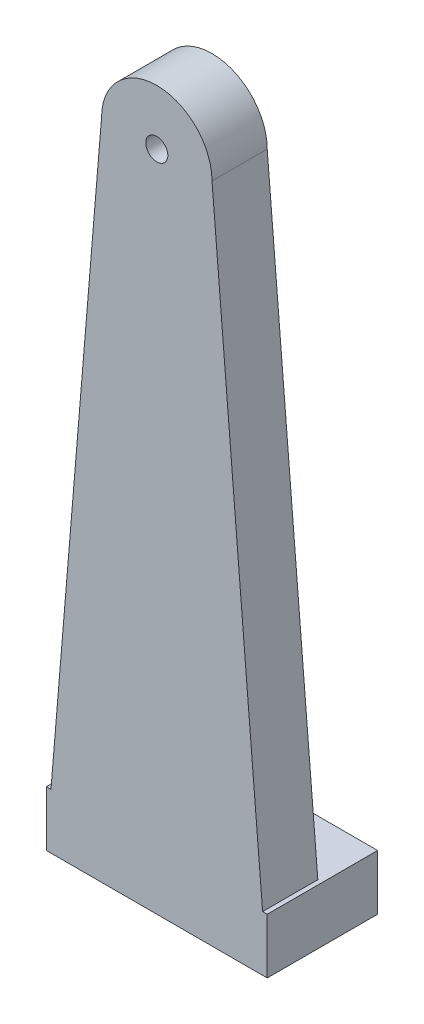
ISO-10303-21;
HEADER;
FILE_DESCRIPTION(('STEP AP214'),'2;1');
FILE_NAME('part.step','',(''),(''),'','','');
FILE_SCHEMA(('AUTOMOTIVE_DESIGN { 1 0 10303 214 1 1 1 1 }'));
ENDSEC;
DATA;
#1=APPLICATION_CONTEXT('core data for automotive mechanical design processes');
#2=APPLICATION_PROTOCOL_DEFINITION('international standard','automotive_design',2000,#1);
#3=PRODUCT_CONTEXT('',#1,'mechanical');
#4=PRODUCT('Part','Part','',(#3));
#5=PRODUCT_RELATED_PRODUCT_CATEGORY('part','',(#4));
#6=PRODUCT_DEFINITION_FORMATION('','',#4);
#7=PRODUCT_DEFINITION_CONTEXT('part definition',#1,'design');
#8=PRODUCT_DEFINITION('design','',#6,#7);
#9=PRODUCT_DEFINITION_SHAPE('','',#8);
#10=(LENGTH_UNIT() NAMED_UNIT(*) SI_UNIT(.MILLI.,.METRE.));
#11=(NAMED_UNIT(*) PLANE_ANGLE_UNIT() SI_UNIT($,.RADIAN.));
#12=(NAMED_UNIT(*) SI_UNIT($,.STERADIAN.) SOLID_ANGLE_UNIT());
#13=UNCERTAINTY_MEASURE_WITH_UNIT(LENGTH_MEASURE(1.E-05),#10,'distance_accuracy_value','');
#14=(GEOMETRIC_REPRESENTATION_CONTEXT(3) GLOBAL_UNCERTAINTY_ASSIGNED_CONTEXT((#13)) GLOBAL_UNIT_ASSIGNED_CONTEXT((#10,
#11,#12)) REPRESENTATION_CONTEXT('',''));
#15=CARTESIAN_POINT('',(0.,0.,0.));
#16=DIRECTION('',(0.,0.,1.));
#17=DIRECTION('',(1.,0.,0.));
#18=AXIS2_PLACEMENT_3D('',#15,#16,#17);
#19=CARTESIAN_POINT('',(5.,35.,5.));
#20=DIRECTION('',(-0.99654575824488,-0.0830454798537399,0.));
#21=DIRECTION('',(0.0830454798537399,-0.99654575824488,0.));
#22=AXIS2_PLACEMENT_3D('',#19,#20,#21);
#23=PLANE('',#22);
#24=DIRECTION('',(-0.0830454798537399,0.99654575824488,0.));
#25=VECTOR('',#24,1.);
#26=CARTESIAN_POINT('',(5.,35.,5.));
#27=LINE('',#26,#25);
#28=CARTESIAN_POINT('',(9.58333333333333,-20.,5.));
#29=VERTEX_POINT('',#28);
#30=CARTESIAN_POINT('',(5.,35.,5.));
#31=VERTEX_POINT('',#30);
#32=EDGE_CURVE('E60',#29,#31,#27,.T.);
#33=ORIENTED_EDGE('',*,*,#32,.F.);
#34=DIRECTION('',(0.,0.,-1.));
#35=VECTOR('',#34,1.);
#36=CARTESIAN_POINT('',(9.58333333333333,-20.,5.));
#37=LINE('',#36,#35);
#38=CARTESIAN_POINT('',(9.58333333333333,-20.,0.));
#39=VERTEX_POINT('',#38);
#40=EDGE_CURVE('E151',#29,#39,#37,.T.);
#41=ORIENTED_EDGE('',*,*,#40,.T.);
#42=DIRECTION('',(-0.0830454798537399,0.99654575824488,0.));
#43=VECTOR('',#42,1.);
#44=CARTESIAN_POINT('',(5.,35.,0.));
#45=LINE('',#44,#43);
#46=CARTESIAN_POINT('',(5.,35.,0.));
#47=VERTEX_POINT('',#46);
#48=EDGE_CURVE('E72',#39,#47,#45,.T.);
#49=ORIENTED_EDGE('',*,*,#48,.T.);
#50=DIRECTION('',(0.,0.,-1.));
#51=VECTOR('',#50,1.);
#52=CARTESIAN_POINT('',(5.,35.,5.));
#53=LINE('',#52,#51);
#54=EDGE_CURVE('E135',#31,#47,#53,.T.);
#55=ORIENTED_EDGE('',*,*,#54,.F.);
#56=EDGE_LOOP('',(#33,#41,#49,#55));
#57=FACE_BOUND('',#56,.T.);
#58=ADVANCED_FACE('F39',(#57),#23,.F.);
#59=CARTESIAN_POINT('',(-5.,35.,5.));
#60=DIRECTION('',(0.99654575824488,-0.0830454798537399,0.));
#61=DIRECTION('',(0.0830454798537399,0.99654575824488,0.));
#62=AXIS2_PLACEMENT_3D('',#59,#60,#61);
#63=PLANE('',#62);
#64=DIRECTION('',(-0.0830454798537399,-0.99654575824488,0.));
#65=VECTOR('',#64,1.);
#66=CARTESIAN_POINT('',(-5.,35.,0.));
#67=LINE('',#66,#65);
#68=CARTESIAN_POINT('',(-5.,35.,0.));
#69=VERTEX_POINT('',#68);
#70=CARTESIAN_POINT('',(-9.58333333333333,-20.,0.));
#71=VERTEX_POINT('',#70);
#72=EDGE_CURVE('E148',#69,#71,#67,.T.);
#73=ORIENTED_EDGE('',*,*,#72,.T.);
#74=DIRECTION('',(0.,0.,1.));
#75=VECTOR('',#74,1.);
#76=CARTESIAN_POINT('',(-9.58333333333333,-20.,5.));
#77=LINE('',#76,#75);
#78=CARTESIAN_POINT('',(-9.58333333333333,-20.,5.));
#79=VERTEX_POINT('',#78);
#80=EDGE_CURVE('E86',#71,#79,#77,.T.);
#81=ORIENTED_EDGE('',*,*,#80,.T.);
#82=DIRECTION('',(-0.0830454798537399,-0.99654575824488,0.));
#83=VECTOR('',#82,1.);
#84=CARTESIAN_POINT('',(-5.,35.,5.));
#85=LINE('',#84,#83);
#86=CARTESIAN_POINT('',(-5.,35.,5.));
#87=VERTEX_POINT('',#86);
#88=EDGE_CURVE('E154',#87,#79,#85,.T.);
#89=ORIENTED_EDGE('',*,*,#88,.F.);
#90=DIRECTION('',(0.,0.,-1.));
#91=VECTOR('',#90,1.);
#92=CARTESIAN_POINT('',(-5.,35.,5.));
#93=LINE('',#92,#91);
#94=EDGE_CURVE('E136',#87,#69,#93,.T.);
#95=ORIENTED_EDGE('',*,*,#94,.T.);
#96=EDGE_LOOP('',(#73,#81,#89,#95));
#97=FACE_BOUND('',#96,.T.);
#98=ADVANCED_FACE('F200',(#97),#63,.F.);
#99=CARTESIAN_POINT('',(10.,-25.,5.));
#100=DIRECTION('',(0.,1.,0.));
#101=DIRECTION('',(0.,0.,1.));
#102=AXIS2_PLACEMENT_3D('',#99,#100,#101);
#103=PLANE('',#102);
#104=CARTESIAN_POINT('',(0.,-25.,0.));
#105=DIRECTION('',(0.,-1.,0.));
#106=DIRECTION('',(0.,0.,-1.));
#107=AXIS2_PLACEMENT_3D('',#104,#105,#106);
#108=CIRCLE('',#107,1.);
#109=CARTESIAN_POINT('',(0.,-25.,-1.));
#110=VERTEX_POINT('',#109);
#111=EDGE_CURVE('E127',#110,#110,#108,.T.);
#112=ORIENTED_EDGE('',*,*,#111,.F.);
#113=EDGE_LOOP('',(#112));
#114=FACE_BOUND('',#113,.T.);
#115=DIRECTION('',(0.,0.,-1.));
#116=VECTOR('',#115,1.);
#117=CARTESIAN_POINT('',(-10.,-25.,5.));
#118=LINE('',#117,#116);
#119=CARTESIAN_POINT('',(-10.,-25.,5.));
#120=VERTEX_POINT('',#119);
#121=CARTESIAN_POINT('',(-10.,-25.,-5.));
#122=VERTEX_POINT('',#121);
#123=EDGE_CURVE('E141',#120,#122,#118,.T.);
#124=ORIENTED_EDGE('',*,*,#123,.T.);
#125=DIRECTION('',(-1.,0.,0.));
#126=VECTOR('',#125,1.);
#127=CARTESIAN_POINT('',(10.,-25.,-5.));
#128=LINE('',#127,#126);
#129=CARTESIAN_POINT('',(10.,-25.,-5.));
#130=VERTEX_POINT('',#129);
#131=EDGE_CURVE('E172',#130,#122,#128,.T.);
#132=ORIENTED_EDGE('',*,*,#131,.F.);
#133=DIRECTION('',(0.,0.,-1.));
#134=VECTOR('',#133,1.);
#135=CARTESIAN_POINT('',(10.,-25.,5.));
#136=LINE('',#135,#134);
#137=CARTESIAN_POINT('',(10.,-25.,5.));
#138=VERTEX_POINT('',#137);
#139=EDGE_CURVE('E145',#138,#130,#136,.T.);
#140=ORIENTED_EDGE('',*,*,#139,.F.);
#141=DIRECTION('',(1.,0.,0.));
#142=VECTOR('',#141,1.);
#143=CARTESIAN_POINT('',(10.,-25.,5.));
#144=LINE('',#143,#142);
#145=EDGE_CURVE('E147',#120,#138,#144,.T.);
#146=ORIENTED_EDGE('',*,*,#145,.F.);
#147=EDGE_LOOP('',(#124,#132,#140,#146));
#148=FACE_BOUND('',#147,.T.);
#149=ADVANCED_FACE('F196',(#114,#148),#103,.F.);
#150=CARTESIAN_POINT('',(0.,0.,5.));
#151=DIRECTION('',(0.,0.,-1.));
#152=DIRECTION('',(-1.,0.,0.));
#153=AXIS2_PLACEMENT_3D('',#150,#151,#152);
#154=PLANE('',#153);
#155=CARTESIAN_POINT('',(0.,35.,5.));
#156=DIRECTION('',(0.,0.,1.));
#157=DIRECTION('',(1.,0.,0.));
#158=AXIS2_PLACEMENT_3D('',#155,#156,#157);
#159=CIRCLE('',#158,1.);
#160=CARTESIAN_POINT('',(1.,35.,5.));
#161=VERTEX_POINT('',#160);
#162=EDGE_CURVE('E126',#161,#161,#159,.T.);
#163=ORIENTED_EDGE('',*,*,#162,.F.);
#164=EDGE_LOOP('',(#163));
#165=FACE_BOUND('',#164,.T.);
#166=ORIENTED_EDGE('',*,*,#32,.T.);
#167=CARTESIAN_POINT('',(0.,35.,5.));
#168=DIRECTION('',(0.,0.,1.));
#169=DIRECTION('',(1.,0.,0.));
#170=AXIS2_PLACEMENT_3D('',#167,#168,#169);
#171=CIRCLE('',#170,5.);
#172=EDGE_CURVE('E185',#31,#87,#171,.T.);
#173=ORIENTED_EDGE('',*,*,#172,.T.);
#174=ORIENTED_EDGE('',*,*,#88,.T.);
#175=DIRECTION('',(1.,0.,0.));
#176=VECTOR('',#175,1.);
#177=CARTESIAN_POINT('',(-10.,-20.,5.));
#178=LINE('',#177,#176);
#179=CARTESIAN_POINT('',(-10.,-20.,5.));
#180=VERTEX_POINT('',#179);
#181=EDGE_CURVE('E178',#180,#79,#178,.T.);
#182=ORIENTED_EDGE('',*,*,#181,.F.);
#183=DIRECTION('',(0.,-1.,0.));
#184=VECTOR('',#183,1.);
#185=CARTESIAN_POINT('',(-10.,-20.,5.));
#186=LINE('',#185,#184);
#187=EDGE_CURVE('E163',#180,#120,#186,.T.);
#188=ORIENTED_EDGE('',*,*,#187,.T.);
#189=ORIENTED_EDGE('',*,*,#145,.T.);
#190=DIRECTION('',(0.,-1.,0.));
#191=VECTOR('',#190,1.);
#192=CARTESIAN_POINT('',(10.,-20.,5.));
#193=LINE('',#192,#191);
#194=CARTESIAN_POINT('',(10.,-20.,5.));
#195=VERTEX_POINT('',#194);
#196=EDGE_CURVE('E166',#195,#138,#193,.T.);
#197=ORIENTED_EDGE('',*,*,#196,.F.);
#198=EDGE_CURVE('E180',#29,#195,#178,.T.);
#199=ORIENTED_EDGE('',*,*,#198,.F.);
#200=EDGE_LOOP('',(#166,#173,#174,#182,#188,#189,#197,#199));
#201=FACE_BOUND('',#200,.T.);
#202=ADVANCED_FACE('F199',(#165,#201),#154,.F.);
#203=CARTESIAN_POINT('',(0.,0.,0.));
#204=DIRECTION('',(0.,0.,-1.));
#205=DIRECTION('',(-1.,0.,0.));
#206=AXIS2_PLACEMENT_3D('',#203,#204,#205);
#207=PLANE('',#206);
#208=CARTESIAN_POINT('',(0.,35.,0.));
#209=DIRECTION('',(0.,0.,1.));
#210=DIRECTION('',(1.,0.,0.));
#211=AXIS2_PLACEMENT_3D('',#208,#209,#210);
#212=CIRCLE('',#211,1.);
#213=CARTESIAN_POINT('',(1.,35.,0.));
#214=VERTEX_POINT('',#213);
#215=EDGE_CURVE('E187',#214,#214,#212,.T.);
#216=ORIENTED_EDGE('',*,*,#215,.T.);
#217=EDGE_LOOP('',(#216));
#218=FACE_BOUND('',#217,.T.);
#219=ORIENTED_EDGE('',*,*,#72,.F.);
#220=CARTESIAN_POINT('',(0.,35.,0.));
#221=DIRECTION('',(0.,0.,1.));
#222=DIRECTION('',(1.,0.,0.));
#223=AXIS2_PLACEMENT_3D('',#220,#221,#222);
#224=CIRCLE('',#223,5.);
#225=EDGE_CURVE('E176',#47,#69,#224,.T.);
#226=ORIENTED_EDGE('',*,*,#225,.F.);
#227=ORIENTED_EDGE('',*,*,#48,.F.);
#228=DIRECTION('',(1.,0.,0.));
#229=VECTOR('',#228,1.);
#230=CARTESIAN_POINT('',(0.,-20.,0.));
#231=LINE('',#230,#229);
#232=CARTESIAN_POINT('',(1.,-20.,0.));
#233=VERTEX_POINT('',#232);
#234=EDGE_CURVE('E80',#233,#39,#231,.T.);
#235=ORIENTED_EDGE('',*,*,#234,.F.);
#236=CARTESIAN_POINT('',(-1.,-20.,0.));
#237=VERTEX_POINT('',#236);
#238=EDGE_CURVE('E125',#237,#233,#231,.T.);
#239=ORIENTED_EDGE('',*,*,#238,.F.);
#240=EDGE_CURVE('E46',#71,#237,#231,.T.);
#241=ORIENTED_EDGE('',*,*,#240,.F.);
#242=EDGE_LOOP('',(#219,#226,#227,#235,#239,#241));
#243=FACE_BOUND('',#242,.T.);
#244=ADVANCED_FACE('F131',(#218,#243),#207,.T.);
#245=CARTESIAN_POINT('',(0.,-20.,0.));
#246=DIRECTION('',(0.,1.,0.));
#247=DIRECTION('',(0.,0.,1.));
#248=AXIS2_PLACEMENT_3D('',#245,#246,#247);
#249=PLANE('',#248);
#250=CARTESIAN_POINT('',(0.,-20.,0.));
#251=DIRECTION('',(0.,1.,0.));
#252=DIRECTION('',(0.,0.,1.));
#253=AXIS2_PLACEMENT_3D('',#250,#251,#252);
#254=CIRCLE('',#253,1.);
#255=EDGE_CURVE('E11',#233,#237,#254,.T.);
#256=ORIENTED_EDGE('',*,*,#255,.F.);
#257=ORIENTED_EDGE('',*,*,#234,.T.);
#258=ORIENTED_EDGE('',*,*,#40,.F.);
#259=ORIENTED_EDGE('',*,*,#198,.T.);
#260=DIRECTION('',(0.,0.,-1.));
#261=VECTOR('',#260,1.);
#262=CARTESIAN_POINT('',(10.,-20.,5.));
#263=LINE('',#262,#261);
#264=CARTESIAN_POINT('',(10.,-20.,-5.));
#265=VERTEX_POINT('',#264);
#266=EDGE_CURVE('E171',#195,#265,#263,.T.);
#267=ORIENTED_EDGE('',*,*,#266,.T.);
#268=DIRECTION('',(-1.,0.,0.));
#269=VECTOR('',#268,1.);
#270=CARTESIAN_POINT('',(10.,-20.,-5.));
#271=LINE('',#270,#269);
#272=CARTESIAN_POINT('',(-10.,-20.,-5.));
#273=VERTEX_POINT('',#272);
#274=EDGE_CURVE('E175',#265,#273,#271,.T.);
#275=ORIENTED_EDGE('',*,*,#274,.T.);
#276=DIRECTION('',(0.,0.,1.));
#277=VECTOR('',#276,1.);
#278=CARTESIAN_POINT('',(-10.,-20.,-5.));
#279=LINE('',#278,#277);
#280=EDGE_CURVE('E181',#273,#180,#279,.T.);
#281=ORIENTED_EDGE('',*,*,#280,.T.);
#282=ORIENTED_EDGE('',*,*,#181,.T.);
#283=ORIENTED_EDGE('',*,*,#80,.F.);
#284=ORIENTED_EDGE('',*,*,#240,.T.);
#285=EDGE_LOOP('',(#256,#257,#258,#259,#267,#275,#281,#282,#283,#284));
#286=FACE_BOUND('',#285,.T.);
#287=ADVANCED_FACE('F133',(#286),#249,.T.);
#288=CARTESIAN_POINT('',(10.,-20.,-5.));
#289=DIRECTION('',(0.,0.,1.));
#290=DIRECTION('',(1.,0.,0.));
#291=AXIS2_PLACEMENT_3D('',#288,#289,#290);
#292=PLANE('',#291);
#293=ORIENTED_EDGE('',*,*,#131,.T.);
#294=DIRECTION('',(0.,-1.,0.));
#295=VECTOR('',#294,1.);
#296=CARTESIAN_POINT('',(-10.,-20.,-5.));
#297=LINE('',#296,#295);
#298=EDGE_CURVE('E160',#273,#122,#297,.T.);
#299=ORIENTED_EDGE('',*,*,#298,.F.);
#300=ORIENTED_EDGE('',*,*,#274,.F.);
#301=DIRECTION('',(0.,-1.,0.));
#302=VECTOR('',#301,1.);
#303=CARTESIAN_POINT('',(10.,-20.,-5.));
#304=LINE('',#303,#302);
#305=EDGE_CURVE('E168',#265,#130,#304,.T.);
#306=ORIENTED_EDGE('',*,*,#305,.T.);
#307=EDGE_LOOP('',(#293,#299,#300,#306));
#308=FACE_BOUND('',#307,.T.);
#309=ADVANCED_FACE('F211',(#308),#292,.F.);
#310=CARTESIAN_POINT('',(-10.,-20.,-5.));
#311=DIRECTION('',(1.,0.,0.));
#312=DIRECTION('',(0.,0.,-1.));
#313=AXIS2_PLACEMENT_3D('',#310,#311,#312);
#314=PLANE('',#313);
#315=ORIENTED_EDGE('',*,*,#298,.T.);
#316=ORIENTED_EDGE('',*,*,#123,.F.);
#317=ORIENTED_EDGE('',*,*,#187,.F.);
#318=ORIENTED_EDGE('',*,*,#280,.F.);
#319=EDGE_LOOP('',(#315,#316,#317,#318));
#320=FACE_BOUND('',#319,.T.);
#321=ADVANCED_FACE('F208',(#320),#314,.F.);
#322=CARTESIAN_POINT('',(10.,-20.,5.));
#323=DIRECTION('',(-1.,0.,0.));
#324=DIRECTION('',(0.,0.,1.));
#325=AXIS2_PLACEMENT_3D('',#322,#323,#324);
#326=PLANE('',#325);
#327=ORIENTED_EDGE('',*,*,#139,.T.);
#328=ORIENTED_EDGE('',*,*,#305,.F.);
#329=ORIENTED_EDGE('',*,*,#266,.F.);
#330=ORIENTED_EDGE('',*,*,#196,.T.);
#331=EDGE_LOOP('',(#327,#328,#329,#330));
#332=FACE_BOUND('',#331,.T.);
#333=ADVANCED_FACE('F215',(#332),#326,.F.);
#334=CARTESIAN_POINT('',(0.,35.,0.));
#335=DIRECTION('',(0.,0.,1.));
#336=DIRECTION('',(1.,0.,0.));
#337=AXIS2_PLACEMENT_3D('',#334,#335,#336);
#338=CYLINDRICAL_SURFACE('',#337,5.);
#339=ORIENTED_EDGE('',*,*,#54,.T.);
#340=ORIENTED_EDGE('',*,*,#225,.T.);
#341=ORIENTED_EDGE('',*,*,#94,.F.);
#342=ORIENTED_EDGE('',*,*,#172,.F.);
#343=EDGE_LOOP('',(#339,#340,#341,#342));
#344=FACE_BOUND('',#343,.T.);
#345=ADVANCED_FACE('F220',(#344),#338,.T.);
#346=CARTESIAN_POINT('',(0.,35.,0.));
#347=DIRECTION('',(0.,0.,1.));
#348=DIRECTION('',(1.,0.,0.));
#349=AXIS2_PLACEMENT_3D('',#346,#347,#348);
#350=CYLINDRICAL_SURFACE('',#349,1.);
#351=ORIENTED_EDGE('',*,*,#162,.T.);
#352=EDGE_LOOP('',(#351));
#353=FACE_BOUND('',#352,.T.);
#354=ORIENTED_EDGE('',*,*,#215,.F.);
#355=EDGE_LOOP('',(#354));
#356=FACE_BOUND('',#355,.T.);
#357=ADVANCED_FACE('F222',(#353,#356),#350,.F.);
#358=CARTESIAN_POINT('',(0.,-20.,0.));
#359=DIRECTION('',(0.,-1.,0.));
#360=DIRECTION('',(0.,0.,-1.));
#361=AXIS2_PLACEMENT_3D('',#358,#359,#360);
#362=CYLINDRICAL_SURFACE('',#361,1.);
#363=CARTESIAN_POINT('',(0.,-20.,0.));
#364=DIRECTION('',(0.,-1.,0.));
#365=DIRECTION('',(0.,0.,-1.));
#366=AXIS2_PLACEMENT_3D('',#363,#364,#365);
#367=CIRCLE('',#366,1.);
#368=EDGE_CURVE('E51',#233,#237,#367,.T.);
#369=ORIENTED_EDGE('',*,*,#368,.F.);
#370=ORIENTED_EDGE('',*,*,#255,.T.);
#371=EDGE_LOOP('',(#369,#370));
#372=FACE_BOUND('',#371,.T.);
#373=ORIENTED_EDGE('',*,*,#111,.T.);
#374=EDGE_LOOP('',(#373));
#375=FACE_BOUND('',#374,.T.);
#376=ADVANCED_FACE('F120',(#372,#375),#362,.F.);
#377=CARTESIAN_POINT('',(0.,-20.,0.));
#378=DIRECTION('',(0.,-1.,0.));
#379=DIRECTION('',(0.,0.,-1.));
#380=AXIS2_PLACEMENT_3D('',#377,#378,#379);
#381=PLANE('',#380);
#382=ORIENTED_EDGE('',*,*,#368,.T.);
#383=ORIENTED_EDGE('',*,*,#238,.T.);
#384=EDGE_LOOP('',(#382,#383));
#385=FACE_BOUND('',#384,.T.);
#386=ADVANCED_FACE('F124',(#385),#381,.T.);
#387=CLOSED_SHELL('',(#58,#98,#149,#202,#244,#287,#309,#321,#333,#345,#357,#376,#386));
#388=MANIFOLD_SOLID_BREP('B2',#387);
#389=ADVANCED_BREP_SHAPE_REPRESENTATION('',(#18,#388),#14);
#390=SHAPE_DEFINITION_REPRESENTATION(#9,#389);
ENDSEC;
END-ISO-10303-21;
